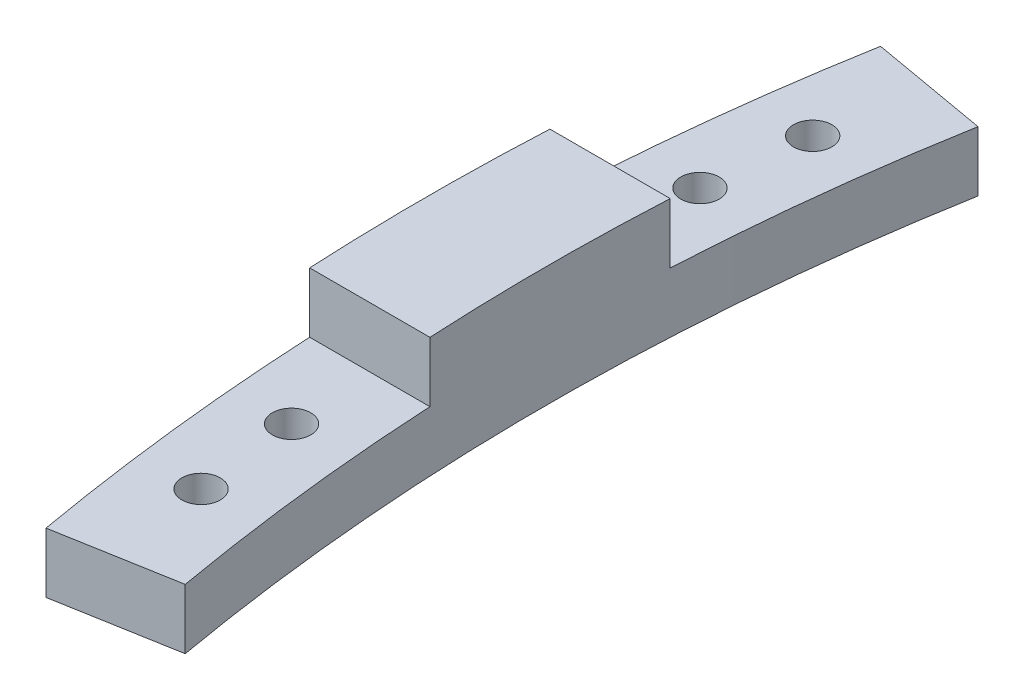
ISO-10303-21;
HEADER;
FILE_DESCRIPTION(('STEP AP214'),'2;1');
FILE_NAME('part.step','',(''),(''),'','','');
FILE_SCHEMA(('AUTOMOTIVE_DESIGN { 1 0 10303 214 1 1 1 1 }'));
ENDSEC;
DATA;
#1=APPLICATION_CONTEXT('core data for automotive mechanical design processes');
#2=APPLICATION_PROTOCOL_DEFINITION('international standard','automotive_design',2000,#1);
#3=PRODUCT_CONTEXT('',#1,'mechanical');
#4=PRODUCT('Part','Part','',(#3));
#5=PRODUCT_RELATED_PRODUCT_CATEGORY('part','',(#4));
#6=PRODUCT_DEFINITION_FORMATION('','',#4);
#7=PRODUCT_DEFINITION_CONTEXT('part definition',#1,'design');
#8=PRODUCT_DEFINITION('design','',#6,#7);
#9=PRODUCT_DEFINITION_SHAPE('','',#8);
#10=(LENGTH_UNIT() NAMED_UNIT(*) SI_UNIT(.MILLI.,.METRE.));
#11=(NAMED_UNIT(*) PLANE_ANGLE_UNIT() SI_UNIT($,.RADIAN.));
#12=(NAMED_UNIT(*) SI_UNIT($,.STERADIAN.) SOLID_ANGLE_UNIT());
#13=UNCERTAINTY_MEASURE_WITH_UNIT(LENGTH_MEASURE(1.E-05),#10,'distance_accuracy_value','');
#14=(GEOMETRIC_REPRESENTATION_CONTEXT(3) GLOBAL_UNCERTAINTY_ASSIGNED_CONTEXT((#13)) GLOBAL_UNIT_ASSIGNED_CONTEXT((#10,
#11,#12)) REPRESENTATION_CONTEXT('',''));
#15=CARTESIAN_POINT('',(0.,0.,0.));
#16=DIRECTION('',(0.,0.,1.));
#17=DIRECTION('',(1.,0.,0.));
#18=AXIS2_PLACEMENT_3D('',#15,#16,#17);
#19=CARTESIAN_POINT('',(0.,5.,0.));
#20=DIRECTION('',(0.,1.,0.));
#21=DIRECTION('',(0.,0.,1.));
#22=AXIS2_PLACEMENT_3D('',#19,#20,#21);
#23=PLANE('',#22);
#24=CARTESIAN_POINT('',(-194.25796612789,5.,-16.9953698357934));
#25=DIRECTION('',(0.,1.,0.));
#26=DIRECTION('',(0.,0.,1.));
#27=AXIS2_PLACEMENT_3D('',#24,#25,#26);
#28=CIRCLE('',#27,1.59999999999999);
#29=CARTESIAN_POINT('',(-194.25796612789,5.,-15.3953698357934));
#30=VERTEX_POINT('',#29);
#31=EDGE_CURVE('E198',#30,#30,#28,.T.);
#32=ORIENTED_EDGE('',*,*,#31,.F.);
#33=EDGE_LOOP('',(#32));
#34=FACE_BOUND('',#33,.T.);
#35=CARTESIAN_POINT('',(-193.331747967893,5.,-25.4526074829103));
#36=DIRECTION('',(0.,1.,0.));
#37=DIRECTION('',(0.,0.,1.));
#38=AXIS2_PLACEMENT_3D('',#35,#36,#37);
#39=CIRCLE('',#38,1.59999999999999);
#40=CARTESIAN_POINT('',(-193.331747967893,5.,-23.8526074829103));
#41=VERTEX_POINT('',#40);
#42=EDGE_CURVE('E192',#41,#41,#39,.T.);
#43=ORIENTED_EDGE('',*,*,#42,.F.);
#44=EDGE_LOOP('',(#43));
#45=FACE_BOUND('',#44,.T.);
#46=DIRECTION('',(-1.,0.,0.));
#47=VECTOR('',#46,1.);
#48=CARTESIAN_POINT('',(-199.749843554382,5.,-9.99999999999997));
#49=LINE('',#48,#47);
#50=CARTESIAN_POINT('',(-189.736659610103,5.,-9.99999999999997));
#51=VERTEX_POINT('',#50);
#52=CARTESIAN_POINT('',(-199.749843554382,5.,-9.99999999999997));
#53=VERTEX_POINT('',#52);
#54=EDGE_CURVE('E48',#51,#53,#49,.T.);
#55=ORIENTED_EDGE('',*,*,#54,.F.);
#56=CARTESIAN_POINT('',(0.,5.,0.));
#57=DIRECTION('',(0.,-1.,0.));
#58=DIRECTION('',(0.,0.,1.));
#59=AXIS2_PLACEMENT_3D('',#56,#57,#58);
#60=CIRCLE('',#59,190.);
#61=CARTESIAN_POINT('',(-187.11347307232,5.,-32.9931537567167));
#62=VERTEX_POINT('',#61);
#63=EDGE_CURVE('E133',#51,#62,#60,.T.);
#64=ORIENTED_EDGE('',*,*,#63,.T.);
#65=DIRECTION('',(-0.984807753012208,0.,-0.17364817766693));
#66=VECTOR('',#65,1.);
#67=CARTESIAN_POINT('',(-196.961550602442,5.,-34.729635533386));
#68=LINE('',#67,#66);
#69=CARTESIAN_POINT('',(-196.961550602442,5.,-34.729635533386));
#70=VERTEX_POINT('',#69);
#71=EDGE_CURVE('E136',#62,#70,#68,.T.);
#72=ORIENTED_EDGE('',*,*,#71,.T.);
#73=CARTESIAN_POINT('',(0.,5.,0.));
#74=DIRECTION('',(0.,1.,0.));
#75=DIRECTION('',(0.,0.,1.));
#76=AXIS2_PLACEMENT_3D('',#73,#74,#75);
#77=CIRCLE('',#76,200.);
#78=EDGE_CURVE('E129',#70,#53,#77,.T.);
#79=ORIENTED_EDGE('',*,*,#78,.T.);
#80=EDGE_LOOP('',(#55,#64,#72,#79));
#81=FACE_BOUND('',#80,.T.);
#82=ADVANCED_FACE('F33',(#34,#45,#81),#23,.T.);
#83=CARTESIAN_POINT('',(0.,5.,0.));
#84=DIRECTION('',(0.,-1.,0.));
#85=DIRECTION('',(0.,0.,-1.));
#86=AXIS2_PLACEMENT_3D('',#83,#84,#85);
#87=CYLINDRICAL_SURFACE('',#86,200.);
#88=CARTESIAN_POINT('',(0.,0.,0.));
#89=DIRECTION('',(0.,1.,0.));
#90=DIRECTION('',(0.,0.,1.));
#91=AXIS2_PLACEMENT_3D('',#88,#89,#90);
#92=CIRCLE('',#91,200.);
#93=CARTESIAN_POINT('',(-196.961550602442,0.,-34.729635533386));
#94=VERTEX_POINT('',#93);
#95=CARTESIAN_POINT('',(-196.961550602442,0.,34.7296355333861));
#96=VERTEX_POINT('',#95);
#97=EDGE_CURVE('E121',#94,#96,#92,.T.);
#98=ORIENTED_EDGE('',*,*,#97,.T.);
#99=DIRECTION('',(0.,-1.,0.));
#100=VECTOR('',#99,1.);
#101=CARTESIAN_POINT('',(-196.961550602442,5.,34.7296355333861));
#102=LINE('',#101,#100);
#103=CARTESIAN_POINT('',(-196.961550602442,5.,34.7296355333861));
#104=VERTEX_POINT('',#103);
#105=EDGE_CURVE('E11',#104,#96,#102,.T.);
#106=ORIENTED_EDGE('',*,*,#105,.F.);
#107=CARTESIAN_POINT('',(-199.749843554382,5.,10.));
#108=VERTEX_POINT('',#107);
#109=EDGE_CURVE('E120',#108,#104,#77,.T.);
#110=ORIENTED_EDGE('',*,*,#109,.F.);
#111=DIRECTION('',(0.,-1.,0.));
#112=VECTOR('',#111,1.);
#113=CARTESIAN_POINT('',(-199.749843554382,10.,10.));
#114=LINE('',#113,#112);
#115=CARTESIAN_POINT('',(-199.749843554382,10.,10.));
#116=VERTEX_POINT('',#115);
#117=EDGE_CURVE('E102',#116,#108,#114,.T.);
#118=ORIENTED_EDGE('',*,*,#117,.F.);
#119=CARTESIAN_POINT('',(0.,10.,0.));
#120=DIRECTION('',(0.,1.,0.));
#121=DIRECTION('',(0.,0.,1.));
#122=AXIS2_PLACEMENT_3D('',#119,#120,#121);
#123=CIRCLE('',#122,200.);
#124=CARTESIAN_POINT('',(-199.749843554382,10.,-9.99999999999997));
#125=VERTEX_POINT('',#124);
#126=EDGE_CURVE('E108',#125,#116,#123,.T.);
#127=ORIENTED_EDGE('',*,*,#126,.F.);
#128=DIRECTION('',(0.,-1.,0.));
#129=VECTOR('',#128,1.);
#130=CARTESIAN_POINT('',(-199.749843554382,10.,-9.99999999999997));
#131=LINE('',#130,#129);
#132=EDGE_CURVE('E166',#125,#53,#131,.T.);
#133=ORIENTED_EDGE('',*,*,#132,.T.);
#134=ORIENTED_EDGE('',*,*,#78,.F.);
#135=DIRECTION('',(0.,-1.,0.));
#136=VECTOR('',#135,1.);
#137=CARTESIAN_POINT('',(-196.961550602442,5.,-34.729635533386));
#138=LINE('',#137,#136);
#139=EDGE_CURVE('E137',#70,#94,#138,.T.);
#140=ORIENTED_EDGE('',*,*,#139,.T.);
#141=EDGE_LOOP('',(#98,#106,#110,#118,#127,#133,#134,#140));
#142=FACE_BOUND('',#141,.T.);
#143=ADVANCED_FACE('F35',(#142),#87,.T.);
#144=CARTESIAN_POINT('',(-187.11347307232,5.,32.9931537567168));
#145=DIRECTION('',(-0.17364817766693,0.,-0.984807753012208));
#146=DIRECTION('',(-0.984807753012208,0.,0.17364817766693));
#147=AXIS2_PLACEMENT_3D('',#144,#145,#146);
#148=PLANE('',#147);
#149=DIRECTION('',(0.984807753012208,0.,-0.17364817766693));
#150=VECTOR('',#149,1.);
#151=CARTESIAN_POINT('',(-187.11347307232,0.,32.9931537567168));
#152=LINE('',#151,#150);
#153=CARTESIAN_POINT('',(-187.11347307232,0.,32.9931537567167));
#154=VERTEX_POINT('',#153);
#155=EDGE_CURVE('E123',#96,#154,#152,.T.);
#156=ORIENTED_EDGE('',*,*,#155,.T.);
#157=DIRECTION('',(0.,-1.,0.));
#158=VECTOR('',#157,1.);
#159=CARTESIAN_POINT('',(-187.11347307232,5.,32.9931537567167));
#160=LINE('',#159,#158);
#161=CARTESIAN_POINT('',(-187.11347307232,5.,32.9931537567167));
#162=VERTEX_POINT('',#161);
#163=EDGE_CURVE('E41',#162,#154,#160,.T.);
#164=ORIENTED_EDGE('',*,*,#163,.F.);
#165=DIRECTION('',(0.984807753012208,0.,-0.17364817766693));
#166=VECTOR('',#165,1.);
#167=CARTESIAN_POINT('',(-187.11347307232,5.,32.9931537567168));
#168=LINE('',#167,#166);
#169=EDGE_CURVE('E131',#104,#162,#168,.T.);
#170=ORIENTED_EDGE('',*,*,#169,.F.);
#171=ORIENTED_EDGE('',*,*,#105,.T.);
#172=EDGE_LOOP('',(#156,#164,#170,#171));
#173=FACE_BOUND('',#172,.T.);
#174=ADVANCED_FACE('F243',(#173),#148,.F.);
#175=CARTESIAN_POINT('',(0.,5.,0.));
#176=DIRECTION('',(0.,-1.,0.));
#177=DIRECTION('',(0.,0.,-1.));
#178=AXIS2_PLACEMENT_3D('',#175,#176,#177);
#179=CYLINDRICAL_SURFACE('',#178,190.);
#180=CARTESIAN_POINT('',(0.,0.,0.));
#181=DIRECTION('',(0.,-1.,0.));
#182=DIRECTION('',(0.,0.,1.));
#183=AXIS2_PLACEMENT_3D('',#180,#181,#182);
#184=CIRCLE('',#183,190.);
#185=CARTESIAN_POINT('',(-187.11347307232,0.,-32.9931537567167));
#186=VERTEX_POINT('',#185);
#187=EDGE_CURVE('E140',#154,#186,#184,.T.);
#188=ORIENTED_EDGE('',*,*,#187,.T.);
#189=DIRECTION('',(0.,-1.,0.));
#190=VECTOR('',#189,1.);
#191=CARTESIAN_POINT('',(-187.11347307232,5.,-32.9931537567167));
#192=LINE('',#191,#190);
#193=EDGE_CURVE('E146',#62,#186,#192,.T.);
#194=ORIENTED_EDGE('',*,*,#193,.F.);
#195=ORIENTED_EDGE('',*,*,#63,.F.);
#196=DIRECTION('',(0.,-1.,0.));
#197=VECTOR('',#196,1.);
#198=CARTESIAN_POINT('',(-189.736659610103,10.,-9.99999999999997));
#199=LINE('',#198,#197);
#200=CARTESIAN_POINT('',(-189.736659610103,10.,-9.99999999999997));
#201=VERTEX_POINT('',#200);
#202=EDGE_CURVE('E125',#201,#51,#199,.T.);
#203=ORIENTED_EDGE('',*,*,#202,.F.);
#204=CARTESIAN_POINT('',(0.,10.,0.));
#205=DIRECTION('',(0.,-1.,0.));
#206=DIRECTION('',(0.,0.,1.));
#207=AXIS2_PLACEMENT_3D('',#204,#205,#206);
#208=CIRCLE('',#207,190.);
#209=CARTESIAN_POINT('',(-189.736659610103,10.,9.99999999999993));
#210=VERTEX_POINT('',#209);
#211=EDGE_CURVE('E107',#210,#201,#208,.T.);
#212=ORIENTED_EDGE('',*,*,#211,.F.);
#213=DIRECTION('',(0.,-1.,0.));
#214=VECTOR('',#213,1.);
#215=CARTESIAN_POINT('',(-189.736659610103,10.,9.99999999999993));
#216=LINE('',#215,#214);
#217=CARTESIAN_POINT('',(-189.736659610103,5.,9.99999999999993));
#218=VERTEX_POINT('',#217);
#219=EDGE_CURVE('E104',#210,#218,#216,.T.);
#220=ORIENTED_EDGE('',*,*,#219,.T.);
#221=EDGE_CURVE('E134',#162,#218,#60,.T.);
#222=ORIENTED_EDGE('',*,*,#221,.F.);
#223=ORIENTED_EDGE('',*,*,#163,.T.);
#224=EDGE_LOOP('',(#188,#194,#195,#203,#212,#220,#222,#223));
#225=FACE_BOUND('',#224,.T.);
#226=ADVANCED_FACE('F153',(#225),#179,.F.);
#227=CARTESIAN_POINT('',(-196.961550602442,5.,-34.729635533386));
#228=DIRECTION('',(-0.17364817766693,0.,0.984807753012208));
#229=DIRECTION('',(0.984807753012208,0.,0.17364817766693));
#230=AXIS2_PLACEMENT_3D('',#227,#228,#229);
#231=PLANE('',#230);
#232=DIRECTION('',(-0.984807753012208,0.,-0.17364817766693));
#233=VECTOR('',#232,1.);
#234=CARTESIAN_POINT('',(-196.961550602442,0.,-34.729635533386));
#235=LINE('',#234,#233);
#236=EDGE_CURVE('E142',#186,#94,#235,.T.);
#237=ORIENTED_EDGE('',*,*,#236,.T.);
#238=ORIENTED_EDGE('',*,*,#139,.F.);
#239=ORIENTED_EDGE('',*,*,#71,.F.);
#240=ORIENTED_EDGE('',*,*,#193,.T.);
#241=EDGE_LOOP('',(#237,#238,#239,#240));
#242=FACE_BOUND('',#241,.T.);
#243=ADVANCED_FACE('F163',(#242),#231,.F.);
#244=CARTESIAN_POINT('',(-194.25796612789,5.,16.9953698357934));
#245=DIRECTION('',(0.,1.,0.));
#246=DIRECTION('',(0.,0.,1.));
#247=AXIS2_PLACEMENT_3D('',#244,#245,#246);
#248=CIRCLE('',#247,1.59999999999999);
#249=CARTESIAN_POINT('',(-194.25796612789,5.,18.5953698357934));
#250=VERTEX_POINT('',#249);
#251=EDGE_CURVE('E186',#250,#250,#248,.T.);
#252=ORIENTED_EDGE('',*,*,#251,.F.);
#253=EDGE_LOOP('',(#252));
#254=FACE_BOUND('',#253,.T.);
#255=CARTESIAN_POINT('',(-193.331747967893,5.,25.4526074829103));
#256=DIRECTION('',(0.,1.,0.));
#257=DIRECTION('',(0.,0.,1.));
#258=AXIS2_PLACEMENT_3D('',#255,#256,#257);
#259=CIRCLE('',#258,1.59999999999999);
#260=CARTESIAN_POINT('',(-193.331747967893,5.,27.0526074829102));
#261=VERTEX_POINT('',#260);
#262=EDGE_CURVE('E180',#261,#261,#259,.T.);
#263=ORIENTED_EDGE('',*,*,#262,.F.);
#264=EDGE_LOOP('',(#263));
#265=FACE_BOUND('',#264,.T.);
#266=DIRECTION('',(1.,0.,0.));
#267=VECTOR('',#266,1.);
#268=CARTESIAN_POINT('',(-199.749843554382,5.,10.));
#269=LINE('',#268,#267);
#270=EDGE_CURVE('E56',#108,#218,#269,.T.);
#271=ORIENTED_EDGE('',*,*,#270,.F.);
#272=ORIENTED_EDGE('',*,*,#109,.T.);
#273=ORIENTED_EDGE('',*,*,#169,.T.);
#274=ORIENTED_EDGE('',*,*,#221,.T.);
#275=EDGE_LOOP('',(#271,#272,#273,#274));
#276=FACE_BOUND('',#275,.T.);
#277=ADVANCED_FACE('F207',(#254,#265,#276),#23,.T.);
#278=CARTESIAN_POINT('',(0.,0.,0.));
#279=DIRECTION('',(0.,1.,0.));
#280=DIRECTION('',(0.,0.,1.));
#281=AXIS2_PLACEMENT_3D('',#278,#279,#280);
#282=PLANE('',#281);
#283=CARTESIAN_POINT('',(-194.25796612789,0.,-16.9953698357934));
#284=DIRECTION('',(0.,1.,0.));
#285=DIRECTION('',(0.,0.,1.));
#286=AXIS2_PLACEMENT_3D('',#283,#284,#285);
#287=CIRCLE('',#286,1.59999999999999);
#288=CARTESIAN_POINT('',(-194.25796612789,0.,-15.3953698357934));
#289=VERTEX_POINT('',#288);
#290=EDGE_CURVE('E195',#289,#289,#287,.T.);
#291=ORIENTED_EDGE('',*,*,#290,.T.);
#292=EDGE_LOOP('',(#291));
#293=FACE_BOUND('',#292,.T.);
#294=CARTESIAN_POINT('',(-193.331747967893,0.,-25.4526074829103));
#295=DIRECTION('',(0.,1.,0.));
#296=DIRECTION('',(0.,0.,1.));
#297=AXIS2_PLACEMENT_3D('',#294,#295,#296);
#298=CIRCLE('',#297,1.59999999999999);
#299=CARTESIAN_POINT('',(-193.331747967893,0.,-23.8526074829103));
#300=VERTEX_POINT('',#299);
#301=EDGE_CURVE('E189',#300,#300,#298,.T.);
#302=ORIENTED_EDGE('',*,*,#301,.T.);
#303=EDGE_LOOP('',(#302));
#304=FACE_BOUND('',#303,.T.);
#305=CARTESIAN_POINT('',(-194.25796612789,0.,16.9953698357934));
#306=DIRECTION('',(0.,1.,0.));
#307=DIRECTION('',(0.,0.,1.));
#308=AXIS2_PLACEMENT_3D('',#305,#306,#307);
#309=CIRCLE('',#308,1.59999999999999);
#310=CARTESIAN_POINT('',(-194.25796612789,0.,18.5953698357934));
#311=VERTEX_POINT('',#310);
#312=EDGE_CURVE('E183',#311,#311,#309,.T.);
#313=ORIENTED_EDGE('',*,*,#312,.T.);
#314=EDGE_LOOP('',(#313));
#315=FACE_BOUND('',#314,.T.);
#316=CARTESIAN_POINT('',(-193.331747967893,0.,25.4526074829103));
#317=DIRECTION('',(0.,1.,0.));
#318=DIRECTION('',(0.,0.,1.));
#319=AXIS2_PLACEMENT_3D('',#316,#317,#318);
#320=CIRCLE('',#319,1.59999999999999);
#321=CARTESIAN_POINT('',(-193.331747967893,0.,27.0526074829102));
#322=VERTEX_POINT('',#321);
#323=EDGE_CURVE('E172',#322,#322,#320,.T.);
#324=ORIENTED_EDGE('',*,*,#323,.T.);
#325=EDGE_LOOP('',(#324));
#326=FACE_BOUND('',#325,.T.);
#327=ORIENTED_EDGE('',*,*,#97,.F.);
#328=ORIENTED_EDGE('',*,*,#236,.F.);
#329=ORIENTED_EDGE('',*,*,#187,.F.);
#330=ORIENTED_EDGE('',*,*,#155,.F.);
#331=EDGE_LOOP('',(#327,#328,#329,#330));
#332=FACE_BOUND('',#331,.T.);
#333=ADVANCED_FACE('F160',(#293,#304,#315,#326,#332),#282,.F.);
#334=CARTESIAN_POINT('',(-199.749843554382,10.,10.));
#335=DIRECTION('',(0.,0.,-1.));
#336=DIRECTION('',(-1.,0.,0.));
#337=AXIS2_PLACEMENT_3D('',#334,#335,#336);
#338=PLANE('',#337);
#339=ORIENTED_EDGE('',*,*,#270,.T.);
#340=ORIENTED_EDGE('',*,*,#219,.F.);
#341=DIRECTION('',(1.,0.,0.));
#342=VECTOR('',#341,1.);
#343=CARTESIAN_POINT('',(-199.749843554382,10.,10.));
#344=LINE('',#343,#342);
#345=EDGE_CURVE('E98',#116,#210,#344,.T.);
#346=ORIENTED_EDGE('',*,*,#345,.F.);
#347=ORIENTED_EDGE('',*,*,#117,.T.);
#348=EDGE_LOOP('',(#339,#340,#346,#347));
#349=FACE_BOUND('',#348,.T.);
#350=ADVANCED_FACE('F100',(#349),#338,.F.);
#351=CARTESIAN_POINT('',(-199.749843554382,10.,-9.99999999999997));
#352=DIRECTION('',(0.,0.,1.));
#353=DIRECTION('',(1.,0.,0.));
#354=AXIS2_PLACEMENT_3D('',#351,#352,#353);
#355=PLANE('',#354);
#356=ORIENTED_EDGE('',*,*,#54,.T.);
#357=ORIENTED_EDGE('',*,*,#132,.F.);
#358=DIRECTION('',(-1.,0.,0.));
#359=VECTOR('',#358,1.);
#360=CARTESIAN_POINT('',(-199.749843554382,10.,-9.99999999999997));
#361=LINE('',#360,#359);
#362=EDGE_CURVE('E113',#201,#125,#361,.T.);
#363=ORIENTED_EDGE('',*,*,#362,.F.);
#364=ORIENTED_EDGE('',*,*,#202,.T.);
#365=EDGE_LOOP('',(#356,#357,#363,#364));
#366=FACE_BOUND('',#365,.T.);
#367=ADVANCED_FACE('F169',(#366),#355,.F.);
#368=CARTESIAN_POINT('',(0.,10.,0.));
#369=DIRECTION('',(0.,1.,0.));
#370=DIRECTION('',(0.,0.,1.));
#371=AXIS2_PLACEMENT_3D('',#368,#369,#370);
#372=PLANE('',#371);
#373=ORIENTED_EDGE('',*,*,#126,.T.);
#374=ORIENTED_EDGE('',*,*,#345,.T.);
#375=ORIENTED_EDGE('',*,*,#211,.T.);
#376=ORIENTED_EDGE('',*,*,#362,.T.);
#377=EDGE_LOOP('',(#373,#374,#375,#376));
#378=FACE_BOUND('',#377,.T.);
#379=ADVANCED_FACE('F111',(#378),#372,.T.);
#380=CARTESIAN_POINT('',(-193.331747967893,5.,25.4526074829103));
#381=DIRECTION('',(0.,1.,0.));
#382=DIRECTION('',(0.,0.,1.));
#383=AXIS2_PLACEMENT_3D('',#380,#381,#382);
#384=CYLINDRICAL_SURFACE('',#383,1.59999999999999);
#385=ORIENTED_EDGE('',*,*,#323,.F.);
#386=EDGE_LOOP('',(#385));
#387=FACE_BOUND('',#386,.T.);
#388=ORIENTED_EDGE('',*,*,#262,.T.);
#389=EDGE_LOOP('',(#388));
#390=FACE_BOUND('',#389,.T.);
#391=ADVANCED_FACE('F221',(#387,#390),#384,.F.);
#392=CARTESIAN_POINT('',(-194.25796612789,5.,16.9953698357934));
#393=DIRECTION('',(0.,1.,0.));
#394=DIRECTION('',(0.,0.,1.));
#395=AXIS2_PLACEMENT_3D('',#392,#393,#394);
#396=CYLINDRICAL_SURFACE('',#395,1.59999999999999);
#397=ORIENTED_EDGE('',*,*,#312,.F.);
#398=EDGE_LOOP('',(#397));
#399=FACE_BOUND('',#398,.T.);
#400=ORIENTED_EDGE('',*,*,#251,.T.);
#401=EDGE_LOOP('',(#400));
#402=FACE_BOUND('',#401,.T.);
#403=ADVANCED_FACE('F212',(#399,#402),#396,.F.);
#404=CARTESIAN_POINT('',(-193.331747967893,5.,-25.4526074829103));
#405=DIRECTION('',(0.,1.,0.));
#406=DIRECTION('',(0.,0.,1.));
#407=AXIS2_PLACEMENT_3D('',#404,#405,#406);
#408=CYLINDRICAL_SURFACE('',#407,1.59999999999999);
#409=ORIENTED_EDGE('',*,*,#301,.F.);
#410=EDGE_LOOP('',(#409));
#411=FACE_BOUND('',#410,.T.);
#412=ORIENTED_EDGE('',*,*,#42,.T.);
#413=EDGE_LOOP('',(#412));
#414=FACE_BOUND('',#413,.T.);
#415=ADVANCED_FACE('F210',(#411,#414),#408,.F.);
#416=CARTESIAN_POINT('',(-194.25796612789,5.,-16.9953698357934));
#417=DIRECTION('',(0.,1.,0.));
#418=DIRECTION('',(0.,0.,1.));
#419=AXIS2_PLACEMENT_3D('',#416,#417,#418);
#420=CYLINDRICAL_SURFACE('',#419,1.59999999999999);
#421=ORIENTED_EDGE('',*,*,#290,.F.);
#422=EDGE_LOOP('',(#421));
#423=FACE_BOUND('',#422,.T.);
#424=ORIENTED_EDGE('',*,*,#31,.T.);
#425=EDGE_LOOP('',(#424));
#426=FACE_BOUND('',#425,.T.);
#427=ADVANCED_FACE('F202',(#423,#426),#420,.F.);
#428=CLOSED_SHELL('',(#82,#143,#174,#226,#243,#277,#333,#350,#367,#379,#391,#403,#415,#427));
#429=MANIFOLD_SOLID_BREP('B2',#428);
#430=ADVANCED_BREP_SHAPE_REPRESENTATION('',(#18,#429),#14);
#431=SHAPE_DEFINITION_REPRESENTATION(#9,#430);
ENDSEC;
END-ISO-10303-21;
